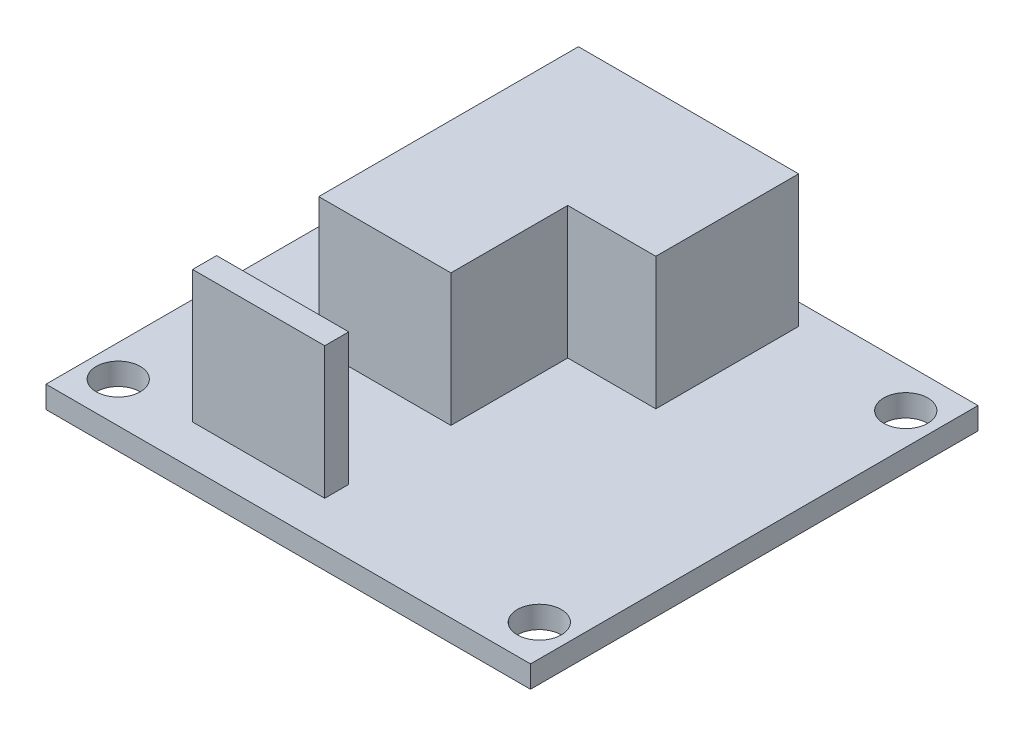
ISO-10303-21;
HEADER;
FILE_DESCRIPTION(('STEP AP214'),'2;1');
FILE_NAME('part.step','',(''),(''),'','','');
FILE_SCHEMA(('AUTOMOTIVE_DESIGN { 1 0 10303 214 1 1 1 1 }'));
ENDSEC;
DATA;
#1=APPLICATION_CONTEXT('core data for automotive mechanical design processes');
#2=APPLICATION_PROTOCOL_DEFINITION('international standard','automotive_design',2000,#1);
#3=PRODUCT_CONTEXT('',#1,'mechanical');
#4=PRODUCT('Part','Part','',(#3));
#5=PRODUCT_RELATED_PRODUCT_CATEGORY('part','',(#4));
#6=PRODUCT_DEFINITION_FORMATION('','',#4);
#7=PRODUCT_DEFINITION_CONTEXT('part definition',#1,'design');
#8=PRODUCT_DEFINITION('design','',#6,#7);
#9=PRODUCT_DEFINITION_SHAPE('','',#8);
#10=(LENGTH_UNIT() NAMED_UNIT(*) SI_UNIT(.MILLI.,.METRE.));
#11=(NAMED_UNIT(*) PLANE_ANGLE_UNIT() SI_UNIT($,.RADIAN.));
#12=(NAMED_UNIT(*) SI_UNIT($,.STERADIAN.) SOLID_ANGLE_UNIT());
#13=UNCERTAINTY_MEASURE_WITH_UNIT(LENGTH_MEASURE(1.E-05),#10,'distance_accuracy_value','');
#14=(GEOMETRIC_REPRESENTATION_CONTEXT(3) GLOBAL_UNCERTAINTY_ASSIGNED_CONTEXT((#13)) GLOBAL_UNIT_ASSIGNED_CONTEXT((#10,
#11,#12)) REPRESENTATION_CONTEXT('',''));
#15=CARTESIAN_POINT('',(0.,0.,0.));
#16=DIRECTION('',(0.,0.,1.));
#17=DIRECTION('',(1.,0.,0.));
#18=AXIS2_PLACEMENT_3D('',#15,#16,#17);
#19=CARTESIAN_POINT('',(0.,11.1125,11.4774357296748));
#20=DIRECTION('',(0.,0.,-1.));
#21=DIRECTION('',(-1.,0.,0.));
#22=AXIS2_PLACEMENT_3D('',#19,#20,#21);
#23=PLANE('',#22);
#24=DIRECTION('',(1.,0.,0.));
#25=VECTOR('',#24,1.);
#26=CARTESIAN_POINT('',(0.,1.5875,11.4774357296748));
#27=LINE('',#26,#25);
#28=CARTESIAN_POINT('',(-9.81675758309226,1.5875,11.4774357296748));
#29=VERTEX_POINT('',#28);
#30=CARTESIAN_POINT('',(-0.291757583092262,1.5875,11.4774357296748));
#31=VERTEX_POINT('',#30);
#32=EDGE_CURVE('E117',#29,#31,#27,.T.);
#33=ORIENTED_EDGE('',*,*,#32,.F.);
#34=DIRECTION('',(0.,-1.,0.));
#35=VECTOR('',#34,1.);
#36=CARTESIAN_POINT('',(-9.81675758309226,11.1125,11.4774357296748));
#37=LINE('',#36,#35);
#38=CARTESIAN_POINT('',(-9.81675758309226,11.1125,11.4774357296748));
#39=VERTEX_POINT('',#38);
#40=EDGE_CURVE('E12',#39,#29,#37,.T.);
#41=ORIENTED_EDGE('',*,*,#40,.F.);
#42=DIRECTION('',(1.,0.,0.));
#43=VECTOR('',#42,1.);
#44=CARTESIAN_POINT('',(0.,11.1125,11.4774357296748));
#45=LINE('',#44,#43);
#46=CARTESIAN_POINT('',(-0.291757583092262,11.1125,11.4774357296748));
#47=VERTEX_POINT('',#46);
#48=EDGE_CURVE('E109',#39,#47,#45,.T.);
#49=ORIENTED_EDGE('',*,*,#48,.T.);
#50=DIRECTION('',(0.,-1.,0.));
#51=VECTOR('',#50,1.);
#52=CARTESIAN_POINT('',(-0.291757583092262,11.1125,11.4774357296748));
#53=LINE('',#52,#51);
#54=EDGE_CURVE('E70',#47,#31,#53,.T.);
#55=ORIENTED_EDGE('',*,*,#54,.T.);
#56=EDGE_LOOP('',(#33,#41,#49,#55));
#57=FACE_BOUND('',#56,.T.);
#58=ADVANCED_FACE('F54',(#57),#23,.T.);
#59=CARTESIAN_POINT('',(-9.81675758309226,11.1125,0.));
#60=DIRECTION('',(-1.,0.,0.));
#61=DIRECTION('',(0.,0.,1.));
#62=AXIS2_PLACEMENT_3D('',#59,#60,#61);
#63=PLANE('',#62);
#64=DIRECTION('',(0.,0.,-1.));
#65=VECTOR('',#64,1.);
#66=CARTESIAN_POINT('',(-9.81675758309226,1.5875,0.));
#67=LINE('',#66,#65);
#68=CARTESIAN_POINT('',(-9.81675758309226,1.5875,13.208));
#69=VERTEX_POINT('',#68);
#70=EDGE_CURVE('E100',#69,#29,#67,.T.);
#71=ORIENTED_EDGE('',*,*,#70,.F.);
#72=DIRECTION('',(0.,-1.,0.));
#73=VECTOR('',#72,1.);
#74=CARTESIAN_POINT('',(-9.81675758309226,11.1125,13.208));
#75=LINE('',#74,#73);
#76=CARTESIAN_POINT('',(-9.81675758309226,11.1125,13.208));
#77=VERTEX_POINT('',#76);
#78=EDGE_CURVE('E62',#77,#69,#75,.T.);
#79=ORIENTED_EDGE('',*,*,#78,.F.);
#80=DIRECTION('',(0.,0.,-1.));
#81=VECTOR('',#80,1.);
#82=CARTESIAN_POINT('',(-9.81675758309226,11.1125,0.));
#83=LINE('',#82,#81);
#84=EDGE_CURVE('E98',#77,#39,#83,.T.);
#85=ORIENTED_EDGE('',*,*,#84,.T.);
#86=ORIENTED_EDGE('',*,*,#40,.T.);
#87=EDGE_LOOP('',(#71,#79,#85,#86));
#88=FACE_BOUND('',#87,.T.);
#89=ADVANCED_FACE('F97',(#88),#63,.T.);
#90=CARTESIAN_POINT('',(0.,11.1125,13.208));
#91=DIRECTION('',(0.,0.,1.));
#92=DIRECTION('',(1.,0.,0.));
#93=AXIS2_PLACEMENT_3D('',#90,#91,#92);
#94=PLANE('',#93);
#95=DIRECTION('',(-1.,0.,0.));
#96=VECTOR('',#95,1.);
#97=CARTESIAN_POINT('',(0.,1.5875,13.208));
#98=LINE('',#97,#96);
#99=CARTESIAN_POINT('',(-0.291757583092262,1.5875,13.208));
#100=VERTEX_POINT('',#99);
#101=EDGE_CURVE('E120',#100,#69,#98,.T.);
#102=ORIENTED_EDGE('',*,*,#101,.F.);
#103=DIRECTION('',(0.,-1.,0.));
#104=VECTOR('',#103,1.);
#105=CARTESIAN_POINT('',(-0.291757583092262,11.1125,13.208));
#106=LINE('',#105,#104);
#107=CARTESIAN_POINT('',(-0.291757583092262,11.1125,13.208));
#108=VERTEX_POINT('',#107);
#109=EDGE_CURVE('E83',#108,#100,#106,.T.);
#110=ORIENTED_EDGE('',*,*,#109,.F.);
#111=DIRECTION('',(-1.,0.,0.));
#112=VECTOR('',#111,1.);
#113=CARTESIAN_POINT('',(0.,11.1125,13.208));
#114=LINE('',#113,#112);
#115=EDGE_CURVE('E108',#108,#77,#114,.T.);
#116=ORIENTED_EDGE('',*,*,#115,.T.);
#117=ORIENTED_EDGE('',*,*,#78,.T.);
#118=EDGE_LOOP('',(#102,#110,#116,#117));
#119=FACE_BOUND('',#118,.T.);
#120=ADVANCED_FACE('F111',(#119),#94,.T.);
#121=CARTESIAN_POINT('',(-0.291757583092262,11.1125,0.));
#122=DIRECTION('',(1.,0.,0.));
#123=DIRECTION('',(0.,0.,-1.));
#124=AXIS2_PLACEMENT_3D('',#121,#122,#123);
#125=PLANE('',#124);
#126=DIRECTION('',(0.,0.,1.));
#127=VECTOR('',#126,1.);
#128=CARTESIAN_POINT('',(-0.291757583092262,1.5875,0.));
#129=LINE('',#128,#127);
#130=EDGE_CURVE('E122',#31,#100,#129,.T.);
#131=ORIENTED_EDGE('',*,*,#130,.F.);
#132=ORIENTED_EDGE('',*,*,#54,.F.);
#133=DIRECTION('',(0.,0.,1.));
#134=VECTOR('',#133,1.);
#135=CARTESIAN_POINT('',(-0.291757583092262,11.1125,0.));
#136=LINE('',#135,#134);
#137=EDGE_CURVE('E112',#47,#108,#136,.T.);
#138=ORIENTED_EDGE('',*,*,#137,.T.);
#139=ORIENTED_EDGE('',*,*,#109,.T.);
#140=EDGE_LOOP('',(#131,#132,#138,#139));
#141=FACE_BOUND('',#140,.T.);
#142=ADVANCED_FACE('F127',(#141),#125,.T.);
#143=CARTESIAN_POINT('',(0.,11.1125,0.));
#144=DIRECTION('',(0.,1.,0.));
#145=DIRECTION('',(0.,0.,1.));
#146=AXIS2_PLACEMENT_3D('',#143,#144,#145);
#147=PLANE('',#146);
#148=ORIENTED_EDGE('',*,*,#48,.F.);
#149=ORIENTED_EDGE('',*,*,#84,.F.);
#150=ORIENTED_EDGE('',*,*,#115,.F.);
#151=ORIENTED_EDGE('',*,*,#137,.F.);
#152=EDGE_LOOP('',(#148,#149,#150,#151));
#153=FACE_BOUND('',#152,.T.);
#154=ADVANCED_FACE('F106',(#153),#147,.T.);
#155=CARTESIAN_POINT('',(0.,1.5875,0.));
#156=DIRECTION('',(0.,1.,0.));
#157=DIRECTION('',(0.,0.,1.));
#158=AXIS2_PLACEMENT_3D('',#155,#156,#157);
#159=PLANE('',#158);
#160=ORIENTED_EDGE('',*,*,#32,.T.);
#161=ORIENTED_EDGE('',*,*,#130,.T.);
#162=ORIENTED_EDGE('',*,*,#101,.T.);
#163=ORIENTED_EDGE('',*,*,#70,.T.);
#164=EDGE_LOOP('',(#160,#161,#162,#163));
#165=FACE_BOUND('',#164,.T.);
#166=ADVANCED_FACE('F134',(#165),#159,.F.);
#167=CLOSED_SHELL('',(#58,#89,#120,#142,#154,#166));
#168=MANIFOLD_SOLID_BREP('B2',#167);
#169=CARTESIAN_POINT('',(0.,11.1125,-14.6038120049849));
#170=DIRECTION('',(0.,0.,-1.));
#171=DIRECTION('',(-1.,0.,0.));
#172=AXIS2_PLACEMENT_3D('',#169,#170,#171);
#173=PLANE('',#172);
#174=DIRECTION('',(1.,0.,0.));
#175=VECTOR('',#174,1.);
#176=CARTESIAN_POINT('',(0.,1.5875,-14.6038120049849));
#177=LINE('',#176,#175);
#178=CARTESIAN_POINT('',(-9.81675758309227,1.5875,-14.6038120049849));
#179=VERTEX_POINT('',#178);
#180=CARTESIAN_POINT('',(6.05824241690774,1.5875,-14.6038120049849));
#181=VERTEX_POINT('',#180);
#182=EDGE_CURVE('E280',#179,#181,#177,.T.);
#183=ORIENTED_EDGE('',*,*,#182,.F.);
#184=DIRECTION('',(0.,-1.,0.));
#185=VECTOR('',#184,1.);
#186=CARTESIAN_POINT('',(-9.81675758309227,11.1125,-14.6038120049849));
#187=LINE('',#186,#185);
#188=CARTESIAN_POINT('',(-9.81675758309227,11.1125,-14.6038120049849));
#189=VERTEX_POINT('',#188);
#190=EDGE_CURVE('E52',#189,#179,#187,.T.);
#191=ORIENTED_EDGE('',*,*,#190,.F.);
#192=DIRECTION('',(1.,0.,0.));
#193=VECTOR('',#192,1.);
#194=CARTESIAN_POINT('',(0.,11.1125,-14.6038120049849));
#195=LINE('',#194,#193);
#196=CARTESIAN_POINT('',(6.05824241690774,11.1125,-14.6038120049849));
#197=VERTEX_POINT('',#196);
#198=EDGE_CURVE('E294',#189,#197,#195,.T.);
#199=ORIENTED_EDGE('',*,*,#198,.T.);
#200=DIRECTION('',(0.,-1.,0.));
#201=VECTOR('',#200,1.);
#202=CARTESIAN_POINT('',(6.05824241690774,11.1125,-14.6038120049849));
#203=LINE('',#202,#201);
#204=EDGE_CURVE('E215',#197,#181,#203,.T.);
#205=ORIENTED_EDGE('',*,*,#204,.T.);
#206=EDGE_LOOP('',(#183,#191,#199,#205));
#207=FACE_BOUND('',#206,.T.);
#208=ADVANCED_FACE('F199',(#207),#173,.T.);
#209=CARTESIAN_POINT('',(-9.81675758309226,11.1125,0.));
#210=DIRECTION('',(-1.,0.,0.));
#211=DIRECTION('',(0.,0.,1.));
#212=AXIS2_PLACEMENT_3D('',#209,#210,#211);
#213=PLANE('',#212);
#214=DIRECTION('',(0.,0.,-1.));
#215=VECTOR('',#214,1.);
#216=CARTESIAN_POINT('',(-9.81675758309226,1.5875,0.));
#217=LINE('',#216,#215);
#218=CARTESIAN_POINT('',(-9.81675758309226,1.5875,4.11270928302274));
#219=VERTEX_POINT('',#218);
#220=EDGE_CURVE('E282',#219,#179,#217,.T.);
#221=ORIENTED_EDGE('',*,*,#220,.F.);
#222=DIRECTION('',(0.,-1.,0.));
#223=VECTOR('',#222,1.);
#224=CARTESIAN_POINT('',(-9.81675758309226,11.1125,4.11270928302274));
#225=LINE('',#224,#223);
#226=CARTESIAN_POINT('',(-9.81675758309226,11.1125,4.11270928302274));
#227=VERTEX_POINT('',#226);
#228=EDGE_CURVE('E207',#227,#219,#225,.T.);
#229=ORIENTED_EDGE('',*,*,#228,.F.);
#230=DIRECTION('',(0.,0.,-1.));
#231=VECTOR('',#230,1.);
#232=CARTESIAN_POINT('',(-9.81675758309226,11.1125,0.));
#233=LINE('',#232,#231);
#234=EDGE_CURVE('E387',#227,#189,#233,.T.);
#235=ORIENTED_EDGE('',*,*,#234,.T.);
#236=ORIENTED_EDGE('',*,*,#190,.T.);
#237=EDGE_LOOP('',(#221,#229,#235,#236));
#238=FACE_BOUND('',#237,.T.);
#239=ADVANCED_FACE('F303',(#238),#213,.T.);
#240=CARTESIAN_POINT('',(0.,11.1125,4.11270928302274));
#241=DIRECTION('',(0.,0.,1.));
#242=DIRECTION('',(1.,0.,0.));
#243=AXIS2_PLACEMENT_3D('',#240,#241,#242);
#244=PLANE('',#243);
#245=DIRECTION('',(-1.,0.,0.));
#246=VECTOR('',#245,1.);
#247=CARTESIAN_POINT('',(0.,1.5875,4.11270928302274));
#248=LINE('',#247,#246);
#249=CARTESIAN_POINT('',(-0.291757583092262,1.5875,4.11270928302274));
#250=VERTEX_POINT('',#249);
#251=EDGE_CURVE('E285',#250,#219,#248,.T.);
#252=ORIENTED_EDGE('',*,*,#251,.F.);
#253=DIRECTION('',(0.,-1.,0.));
#254=VECTOR('',#253,1.);
#255=CARTESIAN_POINT('',(-0.291757583092262,11.1125,4.11270928302274));
#256=LINE('',#255,#254);
#257=CARTESIAN_POINT('',(-0.291757583092262,11.1125,4.11270928302274));
#258=VERTEX_POINT('',#257);
#259=EDGE_CURVE('E262',#258,#250,#256,.T.);
#260=ORIENTED_EDGE('',*,*,#259,.F.);
#261=DIRECTION('',(-1.,0.,0.));
#262=VECTOR('',#261,1.);
#263=CARTESIAN_POINT('',(0.,11.1125,4.11270928302274));
#264=LINE('',#263,#262);
#265=EDGE_CURVE('E272',#258,#227,#264,.T.);
#266=ORIENTED_EDGE('',*,*,#265,.T.);
#267=ORIENTED_EDGE('',*,*,#228,.T.);
#268=EDGE_LOOP('',(#252,#260,#266,#267));
#269=FACE_BOUND('',#268,.T.);
#270=ADVANCED_FACE('F300',(#269),#244,.T.);
#271=CARTESIAN_POINT('',(-0.291757583092262,11.1125,0.));
#272=DIRECTION('',(1.,0.,0.));
#273=DIRECTION('',(0.,0.,-1.));
#274=AXIS2_PLACEMENT_3D('',#271,#272,#273);
#275=PLANE('',#274);
#276=DIRECTION('',(0.,0.,1.));
#277=VECTOR('',#276,1.);
#278=CARTESIAN_POINT('',(-0.291757583092262,1.5875,0.));
#279=LINE('',#278,#277);
#280=CARTESIAN_POINT('',(-0.291757583092263,1.5875,-4.3097252965807));
#281=VERTEX_POINT('',#280);
#282=EDGE_CURVE('E258',#281,#250,#279,.T.);
#283=ORIENTED_EDGE('',*,*,#282,.F.);
#284=DIRECTION('',(0.,-1.,0.));
#285=VECTOR('',#284,1.);
#286=CARTESIAN_POINT('',(-0.291757583092263,11.1125,-4.3097252965807));
#287=LINE('',#286,#285);
#288=CARTESIAN_POINT('',(-0.291757583092263,11.1125,-4.3097252965807));
#289=VERTEX_POINT('',#288);
#290=EDGE_CURVE('E253',#289,#281,#287,.T.);
#291=ORIENTED_EDGE('',*,*,#290,.F.);
#292=DIRECTION('',(0.,0.,1.));
#293=VECTOR('',#292,1.);
#294=CARTESIAN_POINT('',(-0.291757583092262,11.1125,0.));
#295=LINE('',#294,#293);
#296=EDGE_CURVE('E256',#289,#258,#295,.T.);
#297=ORIENTED_EDGE('',*,*,#296,.T.);
#298=ORIENTED_EDGE('',*,*,#259,.T.);
#299=EDGE_LOOP('',(#283,#291,#297,#298));
#300=FACE_BOUND('',#299,.T.);
#301=ADVANCED_FACE('F255',(#300),#275,.T.);
#302=CARTESIAN_POINT('',(0.,11.1125,-4.3097252965807));
#303=DIRECTION('',(0.,0.,1.));
#304=DIRECTION('',(1.,0.,0.));
#305=AXIS2_PLACEMENT_3D('',#302,#303,#304);
#306=PLANE('',#305);
#307=DIRECTION('',(-1.,0.,0.));
#308=VECTOR('',#307,1.);
#309=CARTESIAN_POINT('',(0.,1.5875,-4.3097252965807));
#310=LINE('',#309,#308);
#311=CARTESIAN_POINT('',(6.05824241690774,1.5875,-4.3097252965807));
#312=VERTEX_POINT('',#311);
#313=EDGE_CURVE('E289',#312,#281,#310,.T.);
#314=ORIENTED_EDGE('',*,*,#313,.F.);
#315=DIRECTION('',(0.,-1.,0.));
#316=VECTOR('',#315,1.);
#317=CARTESIAN_POINT('',(6.05824241690774,11.1125,-4.3097252965807));
#318=LINE('',#317,#316);
#319=CARTESIAN_POINT('',(6.05824241690774,11.1125,-4.3097252965807));
#320=VERTEX_POINT('',#319);
#321=EDGE_CURVE('E234',#320,#312,#318,.T.);
#322=ORIENTED_EDGE('',*,*,#321,.F.);
#323=DIRECTION('',(-1.,0.,0.));
#324=VECTOR('',#323,1.);
#325=CARTESIAN_POINT('',(0.,11.1125,-4.3097252965807));
#326=LINE('',#325,#324);
#327=EDGE_CURVE('E269',#320,#289,#326,.T.);
#328=ORIENTED_EDGE('',*,*,#327,.T.);
#329=ORIENTED_EDGE('',*,*,#290,.T.);
#330=EDGE_LOOP('',(#314,#322,#328,#329));
#331=FACE_BOUND('',#330,.T.);
#332=ADVANCED_FACE('F274',(#331),#306,.T.);
#333=CARTESIAN_POINT('',(6.05824241690774,11.1125,0.));
#334=DIRECTION('',(1.,0.,0.));
#335=DIRECTION('',(0.,0.,-1.));
#336=AXIS2_PLACEMENT_3D('',#333,#334,#335);
#337=PLANE('',#336);
#338=DIRECTION('',(0.,0.,1.));
#339=VECTOR('',#338,1.);
#340=CARTESIAN_POINT('',(6.05824241690774,1.5875,0.));
#341=LINE('',#340,#339);
#342=EDGE_CURVE('E291',#181,#312,#341,.T.);
#343=ORIENTED_EDGE('',*,*,#342,.F.);
#344=ORIENTED_EDGE('',*,*,#204,.F.);
#345=DIRECTION('',(0.,0.,1.));
#346=VECTOR('',#345,1.);
#347=CARTESIAN_POINT('',(6.05824241690774,11.1125,0.));
#348=LINE('',#347,#346);
#349=EDGE_CURVE('E275',#197,#320,#348,.T.);
#350=ORIENTED_EDGE('',*,*,#349,.T.);
#351=ORIENTED_EDGE('',*,*,#321,.T.);
#352=EDGE_LOOP('',(#343,#344,#350,#351));
#353=FACE_BOUND('',#352,.T.);
#354=ADVANCED_FACE('F306',(#353),#337,.T.);
#355=CARTESIAN_POINT('',(0.,11.1125,0.));
#356=DIRECTION('',(0.,1.,0.));
#357=DIRECTION('',(0.,0.,1.));
#358=AXIS2_PLACEMENT_3D('',#355,#356,#357);
#359=PLANE('',#358);
#360=ORIENTED_EDGE('',*,*,#198,.F.);
#361=ORIENTED_EDGE('',*,*,#234,.F.);
#362=ORIENTED_EDGE('',*,*,#265,.F.);
#363=ORIENTED_EDGE('',*,*,#296,.F.);
#364=ORIENTED_EDGE('',*,*,#327,.F.);
#365=ORIENTED_EDGE('',*,*,#349,.F.);
#366=EDGE_LOOP('',(#360,#361,#362,#363,#364,#365));
#367=FACE_BOUND('',#366,.T.);
#368=ADVANCED_FACE('F267',(#367),#359,.T.);
#369=CARTESIAN_POINT('',(0.,1.5875,0.));
#370=DIRECTION('',(0.,1.,0.));
#371=DIRECTION('',(0.,0.,1.));
#372=AXIS2_PLACEMENT_3D('',#369,#370,#371);
#373=PLANE('',#372);
#374=ORIENTED_EDGE('',*,*,#182,.T.);
#375=ORIENTED_EDGE('',*,*,#342,.T.);
#376=ORIENTED_EDGE('',*,*,#313,.T.);
#377=ORIENTED_EDGE('',*,*,#282,.T.);
#378=ORIENTED_EDGE('',*,*,#251,.T.);
#379=ORIENTED_EDGE('',*,*,#220,.T.);
#380=EDGE_LOOP('',(#374,#375,#376,#377,#378,#379));
#381=FACE_BOUND('',#380,.T.);
#382=ADVANCED_FACE('F305',(#381),#373,.F.);
#383=CLOSED_SHELL('',(#208,#239,#270,#301,#332,#354,#368,#382));
#384=MANIFOLD_SOLID_BREP('B6',#383);
#385=CARTESIAN_POINT('',(0.,1.5875,11.4774357296748));
#386=DIRECTION('',(0.,0.,-1.));
#387=DIRECTION('',(-1.,0.,0.));
#388=AXIS2_PLACEMENT_3D('',#385,#386,#387);
#389=PLANE('',#388);
#390=DIRECTION('',(1.,0.,0.));
#391=VECTOR('',#390,1.);
#392=CARTESIAN_POINT('',(0.,0.,11.4774357296748));
#393=LINE('',#392,#391);
#394=CARTESIAN_POINT('',(-9.81675758309226,0.,11.4774357296748));
#395=VERTEX_POINT('',#394);
#396=CARTESIAN_POINT('',(-0.291757583092262,0.,11.4774357296748));
#397=VERTEX_POINT('',#396);
#398=EDGE_CURVE('E568',#395,#397,#393,.T.);
#399=ORIENTED_EDGE('',*,*,#398,.T.);
#400=DIRECTION('',(0.,-1.,0.));
#401=VECTOR('',#400,1.);
#402=CARTESIAN_POINT('',(-0.291757583092262,1.5875,11.4774357296748));
#403=LINE('',#402,#401);
#404=CARTESIAN_POINT('',(-0.291757583092262,1.5875,11.4774357296748));
#405=VERTEX_POINT('',#404);
#406=EDGE_CURVE('E197',#405,#397,#403,.T.);
#407=ORIENTED_EDGE('',*,*,#406,.F.);
#408=DIRECTION('',(1.,0.,0.));
#409=VECTOR('',#408,1.);
#410=CARTESIAN_POINT('',(0.,1.5875,11.4774357296748));
#411=LINE('',#410,#409);
#412=CARTESIAN_POINT('',(-9.81675758309226,1.5875,11.4774357296748));
#413=VERTEX_POINT('',#412);
#414=EDGE_CURVE('E509',#413,#405,#411,.T.);
#415=ORIENTED_EDGE('',*,*,#414,.F.);
#416=DIRECTION('',(0.,-1.,0.));
#417=VECTOR('',#416,1.);
#418=CARTESIAN_POINT('',(-9.81675758309226,1.5875,11.4774357296748));
#419=LINE('',#418,#417);
#420=EDGE_CURVE('E412',#413,#395,#419,.T.);
#421=ORIENTED_EDGE('',*,*,#420,.T.);
#422=EDGE_LOOP('',(#399,#407,#415,#421));
#423=FACE_BOUND('',#422,.T.);
#424=ADVANCED_FACE('F393',(#423),#389,.F.);
#425=CARTESIAN_POINT('',(-0.291757583092262,1.5875,0.));
#426=DIRECTION('',(1.,0.,0.));
#427=DIRECTION('',(0.,0.,-1.));
#428=AXIS2_PLACEMENT_3D('',#425,#426,#427);
#429=PLANE('',#428);
#430=DIRECTION('',(0.,0.,1.));
#431=VECTOR('',#430,1.);
#432=CARTESIAN_POINT('',(-0.291757583092262,0.,0.));
#433=LINE('',#432,#431);
#434=CARTESIAN_POINT('',(-0.291757583092262,0.,13.208));
#435=VERTEX_POINT('',#434);
#436=EDGE_CURVE('E515',#397,#435,#433,.T.);
#437=ORIENTED_EDGE('',*,*,#436,.T.);
#438=DIRECTION('',(0.,-1.,0.));
#439=VECTOR('',#438,1.);
#440=CARTESIAN_POINT('',(-0.291757583092262,1.5875,13.208));
#441=LINE('',#440,#439);
#442=CARTESIAN_POINT('',(-0.291757583092262,1.5875,13.208));
#443=VERTEX_POINT('',#442);
#444=EDGE_CURVE('E403',#443,#435,#441,.T.);
#445=ORIENTED_EDGE('',*,*,#444,.F.);
#446=DIRECTION('',(0.,0.,1.));
#447=VECTOR('',#446,1.);
#448=CARTESIAN_POINT('',(-0.291757583092262,1.5875,0.));
#449=LINE('',#448,#447);
#450=EDGE_CURVE('E502',#405,#443,#449,.T.);
#451=ORIENTED_EDGE('',*,*,#450,.F.);
#452=ORIENTED_EDGE('',*,*,#406,.T.);
#453=EDGE_LOOP('',(#437,#445,#451,#452));
#454=FACE_BOUND('',#453,.T.);
#455=ADVANCED_FACE('F514',(#454),#429,.F.);
#456=CARTESIAN_POINT('',(0.,1.5875,13.208));
#457=DIRECTION('',(0.,0.,-1.));
#458=DIRECTION('',(-1.,0.,0.));
#459=AXIS2_PLACEMENT_3D('',#456,#457,#458);
#460=PLANE('',#459);
#461=DIRECTION('',(1.,0.,0.));
#462=VECTOR('',#461,1.);
#463=CARTESIAN_POINT('',(0.,0.,13.208));
#464=LINE('',#463,#462);
#465=CARTESIAN_POINT('',(-9.81675758309226,0.,13.208));
#466=VERTEX_POINT('',#465);
#467=EDGE_CURVE('E571',#466,#435,#464,.T.);
#468=ORIENTED_EDGE('',*,*,#467,.F.);
#469=DIRECTION('',(0.,-1.,0.));
#470=VECTOR('',#469,1.);
#471=CARTESIAN_POINT('',(-9.81675758309226,1.5875,13.208));
#472=LINE('',#471,#470);
#473=CARTESIAN_POINT('',(-9.81675758309226,1.5875,13.208));
#474=VERTEX_POINT('',#473);
#475=EDGE_CURVE('E456',#474,#466,#472,.T.);
#476=ORIENTED_EDGE('',*,*,#475,.F.);
#477=DIRECTION('',(1.,0.,0.));
#478=VECTOR('',#477,1.);
#479=CARTESIAN_POINT('',(0.,1.5875,13.208));
#480=LINE('',#479,#478);
#481=EDGE_CURVE('E508',#474,#443,#480,.T.);
#482=ORIENTED_EDGE('',*,*,#481,.T.);
#483=ORIENTED_EDGE('',*,*,#444,.T.);
#484=EDGE_LOOP('',(#468,#476,#482,#483));
#485=FACE_BOUND('',#484,.T.);
#486=ADVANCED_FACE('F519',(#485),#460,.T.);
#487=CARTESIAN_POINT('',(0.,1.5875,-14.6038120049849));
#488=DIRECTION('',(0.,0.,-1.));
#489=DIRECTION('',(-1.,0.,0.));
#490=AXIS2_PLACEMENT_3D('',#487,#488,#489);
#491=PLANE('',#490);
#492=DIRECTION('',(1.,0.,0.));
#493=VECTOR('',#492,1.);
#494=CARTESIAN_POINT('',(0.,0.,-14.6038120049849));
#495=LINE('',#494,#493);
#496=CARTESIAN_POINT('',(-9.81675758309227,0.,-14.6038120049849));
#497=VERTEX_POINT('',#496);
#498=CARTESIAN_POINT('',(6.05824241690774,0.,-14.6038120049849));
#499=VERTEX_POINT('',#498);
#500=EDGE_CURVE('E550',#497,#499,#495,.T.);
#501=ORIENTED_EDGE('',*,*,#500,.T.);
#502=DIRECTION('',(0.,-1.,0.));
#503=VECTOR('',#502,1.);
#504=CARTESIAN_POINT('',(6.05824241690774,1.5875,-14.6038120049849));
#505=LINE('',#504,#503);
#506=CARTESIAN_POINT('',(6.05824241690774,1.5875,-14.6038120049849));
#507=VERTEX_POINT('',#506);
#508=EDGE_CURVE('E584',#507,#499,#505,.T.);
#509=ORIENTED_EDGE('',*,*,#508,.F.);
#510=DIRECTION('',(1.,0.,0.));
#511=VECTOR('',#510,1.);
#512=CARTESIAN_POINT('',(0.,1.5875,-14.6038120049849));
#513=LINE('',#512,#511);
#514=CARTESIAN_POINT('',(-9.81675758309227,1.5875,-14.6038120049849));
#515=VERTEX_POINT('',#514);
#516=EDGE_CURVE('E624',#515,#507,#513,.T.);
#517=ORIENTED_EDGE('',*,*,#516,.F.);
#518=DIRECTION('',(0.,-1.,0.));
#519=VECTOR('',#518,1.);
#520=CARTESIAN_POINT('',(-9.81675758309227,1.5875,-14.6038120049849));
#521=LINE('',#520,#519);
#522=EDGE_CURVE('E586',#515,#497,#521,.T.);
#523=ORIENTED_EDGE('',*,*,#522,.T.);
#524=EDGE_LOOP('',(#501,#509,#517,#523));
#525=FACE_BOUND('',#524,.T.);
#526=ADVANCED_FACE('F663',(#525),#491,.F.);
#527=CARTESIAN_POINT('',(6.05824241690774,1.5875,0.));
#528=DIRECTION('',(1.,0.,0.));
#529=DIRECTION('',(0.,0.,-1.));
#530=AXIS2_PLACEMENT_3D('',#527,#528,#529);
#531=PLANE('',#530);
#532=DIRECTION('',(0.,0.,1.));
#533=VECTOR('',#532,1.);
#534=CARTESIAN_POINT('',(6.05824241690774,0.,0.));
#535=LINE('',#534,#533);
#536=CARTESIAN_POINT('',(6.05824241690774,0.,-4.3097252965807));
#537=VERTEX_POINT('',#536);
#538=EDGE_CURVE('E553',#499,#537,#535,.T.);
#539=ORIENTED_EDGE('',*,*,#538,.T.);
#540=DIRECTION('',(0.,-1.,0.));
#541=VECTOR('',#540,1.);
#542=CARTESIAN_POINT('',(6.05824241690774,1.5875,-4.3097252965807));
#543=LINE('',#542,#541);
#544=CARTESIAN_POINT('',(6.05824241690774,1.5875,-4.3097252965807));
#545=VERTEX_POINT('',#544);
#546=EDGE_CURVE('E594',#545,#537,#543,.T.);
#547=ORIENTED_EDGE('',*,*,#546,.F.);
#548=DIRECTION('',(0.,0.,1.));
#549=VECTOR('',#548,1.);
#550=CARTESIAN_POINT('',(6.05824241690774,1.5875,0.));
#551=LINE('',#550,#549);
#552=EDGE_CURVE('E634',#507,#545,#551,.T.);
#553=ORIENTED_EDGE('',*,*,#552,.F.);
#554=ORIENTED_EDGE('',*,*,#508,.T.);
#555=EDGE_LOOP('',(#539,#547,#553,#554));
#556=FACE_BOUND('',#555,.T.);
#557=ADVANCED_FACE('F665',(#556),#531,.F.);
#558=CARTESIAN_POINT('',(0.,1.5875,-4.3097252965807));
#559=DIRECTION('',(0.,0.,-1.));
#560=DIRECTION('',(-1.,0.,0.));
#561=AXIS2_PLACEMENT_3D('',#558,#559,#560);
#562=PLANE('',#561);
#563=DIRECTION('',(1.,0.,0.));
#564=VECTOR('',#563,1.);
#565=CARTESIAN_POINT('',(0.,0.,-4.3097252965807));
#566=LINE('',#565,#564);
#567=CARTESIAN_POINT('',(-0.291757583092263,0.,-4.3097252965807));
#568=VERTEX_POINT('',#567);
#569=EDGE_CURVE('E556',#568,#537,#566,.T.);
#570=ORIENTED_EDGE('',*,*,#569,.F.);
#571=DIRECTION('',(0.,-1.,0.));
#572=VECTOR('',#571,1.);
#573=CARTESIAN_POINT('',(-0.291757583092263,1.5875,-4.3097252965807));
#574=LINE('',#573,#572);
#575=CARTESIAN_POINT('',(-0.291757583092263,1.5875,-4.3097252965807));
#576=VERTEX_POINT('',#575);
#577=EDGE_CURVE('E592',#576,#568,#574,.T.);
#578=ORIENTED_EDGE('',*,*,#577,.F.);
#579=DIRECTION('',(1.,0.,0.));
#580=VECTOR('',#579,1.);
#581=CARTESIAN_POINT('',(0.,1.5875,-4.3097252965807));
#582=LINE('',#581,#580);
#583=EDGE_CURVE('E636',#576,#545,#582,.T.);
#584=ORIENTED_EDGE('',*,*,#583,.T.);
#585=ORIENTED_EDGE('',*,*,#546,.T.);
#586=EDGE_LOOP('',(#570,#578,#584,#585));
#587=FACE_BOUND('',#586,.T.);
#588=ADVANCED_FACE('F669',(#587),#562,.T.);
#589=CARTESIAN_POINT('',(-0.291757583092262,1.5875,0.));
#590=DIRECTION('',(1.,0.,0.));
#591=DIRECTION('',(0.,0.,-1.));
#592=AXIS2_PLACEMENT_3D('',#589,#590,#591);
#593=PLANE('',#592);
#594=DIRECTION('',(0.,0.,1.));
#595=VECTOR('',#594,1.);
#596=CARTESIAN_POINT('',(-0.291757583092262,0.,0.));
#597=LINE('',#596,#595);
#598=CARTESIAN_POINT('',(-0.291757583092262,0.,4.11270928302274));
#599=VERTEX_POINT('',#598);
#600=EDGE_CURVE('E559',#568,#599,#597,.T.);
#601=ORIENTED_EDGE('',*,*,#600,.T.);
#602=DIRECTION('',(0.,-1.,0.));
#603=VECTOR('',#602,1.);
#604=CARTESIAN_POINT('',(-0.291757583092262,1.5875,4.11270928302274));
#605=LINE('',#604,#603);
#606=CARTESIAN_POINT('',(-0.291757583092262,1.5875,4.11270928302274));
#607=VERTEX_POINT('',#606);
#608=EDGE_CURVE('E590',#607,#599,#605,.T.);
#609=ORIENTED_EDGE('',*,*,#608,.F.);
#610=DIRECTION('',(0.,0.,1.));
#611=VECTOR('',#610,1.);
#612=CARTESIAN_POINT('',(-0.291757583092262,1.5875,0.));
#613=LINE('',#612,#611);
#614=EDGE_CURVE('E639',#576,#607,#613,.T.);
#615=ORIENTED_EDGE('',*,*,#614,.F.);
#616=ORIENTED_EDGE('',*,*,#577,.T.);
#617=EDGE_LOOP('',(#601,#609,#615,#616));
#618=FACE_BOUND('',#617,.T.);
#619=ADVANCED_FACE('F671',(#618),#593,.F.);
#620=CARTESIAN_POINT('',(0.,1.5875,4.11270928302274));
#621=DIRECTION('',(0.,0.,-1.));
#622=DIRECTION('',(-1.,0.,0.));
#623=AXIS2_PLACEMENT_3D('',#620,#621,#622);
#624=PLANE('',#623);
#625=DIRECTION('',(1.,0.,0.));
#626=VECTOR('',#625,1.);
#627=CARTESIAN_POINT('',(0.,0.,4.11270928302274));
#628=LINE('',#627,#626);
#629=CARTESIAN_POINT('',(-9.81675758309226,0.,4.11270928302274));
#630=VERTEX_POINT('',#629);
#631=EDGE_CURVE('E562',#630,#599,#628,.T.);
#632=ORIENTED_EDGE('',*,*,#631,.F.);
#633=DIRECTION('',(0.,-1.,0.));
#634=VECTOR('',#633,1.);
#635=CARTESIAN_POINT('',(-9.81675758309226,1.5875,4.11270928302274));
#636=LINE('',#635,#634);
#637=CARTESIAN_POINT('',(-9.81675758309226,1.5875,4.11270928302274));
#638=VERTEX_POINT('',#637);
#639=EDGE_CURVE('E588',#638,#630,#636,.T.);
#640=ORIENTED_EDGE('',*,*,#639,.F.);
#641=DIRECTION('',(1.,0.,0.));
#642=VECTOR('',#641,1.);
#643=CARTESIAN_POINT('',(0.,1.5875,4.11270928302274));
#644=LINE('',#643,#642);
#645=EDGE_CURVE('E641',#638,#607,#644,.T.);
#646=ORIENTED_EDGE('',*,*,#645,.T.);
#647=ORIENTED_EDGE('',*,*,#608,.T.);
#648=EDGE_LOOP('',(#632,#640,#646,#647));
#649=FACE_BOUND('',#648,.T.);
#650=ADVANCED_FACE('F658',(#649),#624,.T.);
#651=CARTESIAN_POINT('',(17.4625,1.5875,0.));
#652=DIRECTION('',(1.,0.,0.));
#653=DIRECTION('',(0.,0.,-1.));
#654=AXIS2_PLACEMENT_3D('',#651,#652,#653);
#655=PLANE('',#654);
#656=DIRECTION('',(0.,0.,1.));
#657=VECTOR('',#656,1.);
#658=CARTESIAN_POINT('',(17.4625,0.,0.));
#659=LINE('',#658,#657);
#660=CARTESIAN_POINT('',(17.4625,0.,-16.129));
#661=VERTEX_POINT('',#660);
#662=CARTESIAN_POINT('',(17.4625,0.,16.129));
#663=VERTEX_POINT('',#662);
#664=EDGE_CURVE('E538',#661,#663,#659,.T.);
#665=ORIENTED_EDGE('',*,*,#664,.F.);
#666=DIRECTION('',(0.,-1.,0.));
#667=VECTOR('',#666,1.);
#668=CARTESIAN_POINT('',(17.4625,1.5875,-16.129));
#669=LINE('',#668,#667);
#670=CARTESIAN_POINT('',(17.4625,1.5875,-16.129));
#671=VERTEX_POINT('',#670);
#672=EDGE_CURVE('E397',#671,#661,#669,.T.);
#673=ORIENTED_EDGE('',*,*,#672,.F.);
#674=DIRECTION('',(0.,0.,1.));
#675=VECTOR('',#674,1.);
#676=CARTESIAN_POINT('',(17.4625,1.5875,0.));
#677=LINE('',#676,#675);
#678=CARTESIAN_POINT('',(17.4625,1.5875,16.129));
#679=VERTEX_POINT('',#678);
#680=EDGE_CURVE('E628',#671,#679,#677,.T.);
#681=ORIENTED_EDGE('',*,*,#680,.T.);
#682=DIRECTION('',(0.,-1.,0.));
#683=VECTOR('',#682,1.);
#684=CARTESIAN_POINT('',(17.4625,1.5875,16.129));
#685=LINE('',#684,#683);
#686=EDGE_CURVE('E531',#679,#663,#685,.T.);
#687=ORIENTED_EDGE('',*,*,#686,.T.);
#688=EDGE_LOOP('',(#665,#673,#681,#687));
#689=FACE_BOUND('',#688,.T.);
#690=ADVANCED_FACE('F611',(#689),#655,.T.);
#691=CARTESIAN_POINT('',(0.,1.5875,-16.129));
#692=DIRECTION('',(0.,0.,-1.));
#693=DIRECTION('',(-1.,0.,0.));
#694=AXIS2_PLACEMENT_3D('',#691,#692,#693);
#695=PLANE('',#694);
#696=DIRECTION('',(1.,0.,0.));
#697=VECTOR('',#696,1.);
#698=CARTESIAN_POINT('',(0.,0.,-16.129));
#699=LINE('',#698,#697);
#700=CARTESIAN_POINT('',(-17.4625,0.,-16.129));
#701=VERTEX_POINT('',#700);
#702=EDGE_CURVE('E541',#701,#661,#699,.T.);
#703=ORIENTED_EDGE('',*,*,#702,.F.);
#704=DIRECTION('',(0.,-1.,0.));
#705=VECTOR('',#704,1.);
#706=CARTESIAN_POINT('',(-17.4625,1.5875,-16.129));
#707=LINE('',#706,#705);
#708=CARTESIAN_POINT('',(-17.4625,1.5875,-16.129));
#709=VERTEX_POINT('',#708);
#710=EDGE_CURVE('E601',#709,#701,#707,.T.);
#711=ORIENTED_EDGE('',*,*,#710,.F.);
#712=DIRECTION('',(1.,0.,0.));
#713=VECTOR('',#712,1.);
#714=CARTESIAN_POINT('',(0.,1.5875,-16.129));
#715=LINE('',#714,#713);
#716=EDGE_CURVE('E610',#709,#671,#715,.T.);
#717=ORIENTED_EDGE('',*,*,#716,.T.);
#718=ORIENTED_EDGE('',*,*,#672,.T.);
#719=EDGE_LOOP('',(#703,#711,#717,#718));
#720=FACE_BOUND('',#719,.T.);
#721=ADVANCED_FACE('F608',(#720),#695,.T.);
#722=CARTESIAN_POINT('',(-17.4625,1.5875,0.));
#723=DIRECTION('',(1.,0.,0.));
#724=DIRECTION('',(0.,0.,-1.));
#725=AXIS2_PLACEMENT_3D('',#722,#723,#724);
#726=PLANE('',#725);
#727=DIRECTION('',(0.,0.,1.));
#728=VECTOR('',#727,1.);
#729=CARTESIAN_POINT('',(-17.4625,0.,0.));
#730=LINE('',#729,#728);
#731=CARTESIAN_POINT('',(-17.4625,0.,16.129));
#732=VERTEX_POINT('',#731);
#733=EDGE_CURVE('E544',#701,#732,#730,.T.);
#734=ORIENTED_EDGE('',*,*,#733,.T.);
#735=DIRECTION('',(0.,-1.,0.));
#736=VECTOR('',#735,1.);
#737=CARTESIAN_POINT('',(-17.4625,1.5875,16.129));
#738=LINE('',#737,#736);
#739=CARTESIAN_POINT('',(-17.4625,1.5875,16.129));
#740=VERTEX_POINT('',#739);
#741=EDGE_CURVE('E599',#740,#732,#738,.T.);
#742=ORIENTED_EDGE('',*,*,#741,.F.);
#743=DIRECTION('',(0.,0.,1.));
#744=VECTOR('',#743,1.);
#745=CARTESIAN_POINT('',(-17.4625,1.5875,0.));
#746=LINE('',#745,#744);
#747=EDGE_CURVE('E619',#709,#740,#746,.T.);
#748=ORIENTED_EDGE('',*,*,#747,.F.);
#749=ORIENTED_EDGE('',*,*,#710,.T.);
#750=EDGE_LOOP('',(#734,#742,#748,#749));
#751=FACE_BOUND('',#750,.T.);
#752=ADVANCED_FACE('F617',(#751),#726,.F.);
#753=CARTESIAN_POINT('',(15.1765,1.5875,13.208));
#754=DIRECTION('',(0.,-1.,0.));
#755=DIRECTION('',(0.,0.,-1.));
#756=AXIS2_PLACEMENT_3D('',#753,#754,#755);
#757=CYLINDRICAL_SURFACE('',#756,1.5875);
#758=CARTESIAN_POINT('',(15.1765,1.5875,13.208));
#759=DIRECTION('',(0.,1.,0.));
#760=DIRECTION('',(0.,0.,1.));
#761=AXIS2_PLACEMENT_3D('',#758,#759,#760);
#762=CIRCLE('',#761,1.5875);
#763=CARTESIAN_POINT('',(15.1765,1.5875,14.7955));
#764=VERTEX_POINT('',#763);
#765=EDGE_CURVE('E522',#764,#764,#762,.T.);
#766=ORIENTED_EDGE('',*,*,#765,.T.);
#767=EDGE_LOOP('',(#766));
#768=FACE_BOUND('',#767,.T.);
#769=CARTESIAN_POINT('',(15.1765,0.,13.208));
#770=DIRECTION('',(0.,1.,0.));
#771=DIRECTION('',(0.,0.,1.));
#772=AXIS2_PLACEMENT_3D('',#769,#770,#771);
#773=CIRCLE('',#772,1.5875);
#774=CARTESIAN_POINT('',(15.1765,0.,14.7955));
#775=VERTEX_POINT('',#774);
#776=EDGE_CURVE('E576',#775,#775,#773,.T.);
#777=ORIENTED_EDGE('',*,*,#776,.F.);
#778=EDGE_LOOP('',(#777));
#779=FACE_BOUND('',#778,.T.);
#780=ADVANCED_FACE('F696',(#768,#779),#757,.F.);
#781=CARTESIAN_POINT('',(-9.81675758309226,1.5875,0.));
#782=DIRECTION('',(1.,0.,0.));
#783=DIRECTION('',(0.,0.,-1.));
#784=AXIS2_PLACEMENT_3D('',#781,#782,#783);
#785=PLANE('',#784);
#786=DIRECTION('',(0.,0.,1.));
#787=VECTOR('',#786,1.);
#788=CARTESIAN_POINT('',(-9.81675758309226,0.,0.));
#789=LINE('',#788,#787);
#790=EDGE_CURVE('E573',#395,#466,#789,.T.);
#791=ORIENTED_EDGE('',*,*,#790,.F.);
#792=ORIENTED_EDGE('',*,*,#420,.F.);
#793=DIRECTION('',(0.,0.,1.));
#794=VECTOR('',#793,1.);
#795=CARTESIAN_POINT('',(-9.81675758309226,1.5875,0.));
#796=LINE('',#795,#794);
#797=EDGE_CURVE('E520',#413,#474,#796,.T.);
#798=ORIENTED_EDGE('',*,*,#797,.T.);
#799=ORIENTED_EDGE('',*,*,#475,.T.);
#800=EDGE_LOOP('',(#791,#792,#798,#799));
#801=FACE_BOUND('',#800,.T.);
#802=ADVANCED_FACE('F689',(#801),#785,.T.);
#803=CARTESIAN_POINT('',(-9.81675758309226,1.5875,0.));
#804=DIRECTION('',(1.,0.,0.));
#805=DIRECTION('',(0.,0.,-1.));
#806=AXIS2_PLACEMENT_3D('',#803,#804,#805);
#807=PLANE('',#806);
#808=DIRECTION('',(0.,0.,1.));
#809=VECTOR('',#808,1.);
#810=CARTESIAN_POINT('',(-9.81675758309226,0.,0.));
#811=LINE('',#810,#809);
#812=EDGE_CURVE('E565',#497,#630,#811,.T.);
#813=ORIENTED_EDGE('',*,*,#812,.F.);
#814=ORIENTED_EDGE('',*,*,#522,.F.);
#815=DIRECTION('',(0.,0.,1.));
#816=VECTOR('',#815,1.);
#817=CARTESIAN_POINT('',(-9.81675758309226,1.5875,0.));
#818=LINE('',#817,#816);
#819=EDGE_CURVE('E644',#515,#638,#818,.T.);
#820=ORIENTED_EDGE('',*,*,#819,.T.);
#821=ORIENTED_EDGE('',*,*,#639,.T.);
#822=EDGE_LOOP('',(#813,#814,#820,#821));
#823=FACE_BOUND('',#822,.T.);
#824=ADVANCED_FACE('F649',(#823),#807,.T.);
#825=CARTESIAN_POINT('',(0.,1.5875,16.129));
#826=DIRECTION('',(0.,0.,-1.));
#827=DIRECTION('',(-1.,0.,0.));
#828=AXIS2_PLACEMENT_3D('',#825,#826,#827);
#829=PLANE('',#828);
#830=DIRECTION('',(1.,0.,0.));
#831=VECTOR('',#830,1.);
#832=CARTESIAN_POINT('',(0.,0.,16.129));
#833=LINE('',#832,#831);
#834=EDGE_CURVE('E547',#732,#663,#833,.T.);
#835=ORIENTED_EDGE('',*,*,#834,.T.);
#836=ORIENTED_EDGE('',*,*,#686,.F.);
#837=DIRECTION('',(1.,0.,0.));
#838=VECTOR('',#837,1.);
#839=CARTESIAN_POINT('',(0.,1.5875,16.129));
#840=LINE('',#839,#838);
#841=EDGE_CURVE('E622',#740,#679,#840,.T.);
#842=ORIENTED_EDGE('',*,*,#841,.F.);
#843=ORIENTED_EDGE('',*,*,#741,.T.);
#844=EDGE_LOOP('',(#835,#836,#842,#843));
#845=FACE_BOUND('',#844,.T.);
#846=ADVANCED_FACE('F621',(#845),#829,.F.);
#847=CARTESIAN_POINT('',(-15.1765,1.5875,-13.208));
#848=DIRECTION('',(0.,-1.,0.));
#849=DIRECTION('',(0.,0.,-1.));
#850=AXIS2_PLACEMENT_3D('',#847,#848,#849);
#851=CYLINDRICAL_SURFACE('',#850,1.5875);
#852=CARTESIAN_POINT('',(-15.1765,1.5875,-13.208));
#853=DIRECTION('',(0.,1.,0.));
#854=DIRECTION('',(0.,0.,1.));
#855=AXIS2_PLACEMENT_3D('',#852,#853,#854);
#856=CIRCLE('',#855,1.5875);
#857=CARTESIAN_POINT('',(-15.1765,1.5875,-11.6205));
#858=VERTEX_POINT('',#857);
#859=EDGE_CURVE('E729',#858,#858,#856,.T.);
#860=ORIENTED_EDGE('',*,*,#859,.T.);
#861=EDGE_LOOP('',(#860));
#862=FACE_BOUND('',#861,.T.);
#863=CARTESIAN_POINT('',(-15.1765,0.,-13.208));
#864=DIRECTION('',(0.,1.,0.));
#865=DIRECTION('',(0.,0.,1.));
#866=AXIS2_PLACEMENT_3D('',#863,#864,#865);
#867=CIRCLE('',#866,1.5875);
#868=CARTESIAN_POINT('',(-15.1765,0.,-11.6205));
#869=VERTEX_POINT('',#868);
#870=EDGE_CURVE('E535',#869,#869,#867,.T.);
#871=ORIENTED_EDGE('',*,*,#870,.F.);
#872=EDGE_LOOP('',(#871));
#873=FACE_BOUND('',#872,.T.);
#874=ADVANCED_FACE('F694',(#862,#873),#851,.F.);
#875=CARTESIAN_POINT('',(15.1765,1.5875,-13.208));
#876=DIRECTION('',(0.,-1.,0.));
#877=DIRECTION('',(0.,0.,-1.));
#878=AXIS2_PLACEMENT_3D('',#875,#876,#877);
#879=CYLINDRICAL_SURFACE('',#878,1.5875);
#880=CARTESIAN_POINT('',(15.1765,1.5875,-13.208));
#881=DIRECTION('',(0.,1.,0.));
#882=DIRECTION('',(0.,0.,1.));
#883=AXIS2_PLACEMENT_3D('',#880,#881,#882);
#884=CIRCLE('',#883,1.5875);
#885=CARTESIAN_POINT('',(15.1765,1.5875,-11.6205));
#886=VERTEX_POINT('',#885);
#887=EDGE_CURVE('E582',#886,#886,#884,.F.);
#888=ORIENTED_EDGE('',*,*,#887,.F.);
#889=EDGE_LOOP('',(#888));
#890=FACE_BOUND('',#889,.T.);
#891=CARTESIAN_POINT('',(15.1765,0.,-13.208));
#892=DIRECTION('',(0.,1.,0.));
#893=DIRECTION('',(0.,0.,1.));
#894=AXIS2_PLACEMENT_3D('',#891,#892,#893);
#895=CIRCLE('',#894,1.5875);
#896=CARTESIAN_POINT('',(15.1765,0.,-11.6205));
#897=VERTEX_POINT('',#896);
#898=EDGE_CURVE('E532',#897,#897,#895,.F.);
#899=ORIENTED_EDGE('',*,*,#898,.T.);
#900=EDGE_LOOP('',(#899));
#901=FACE_BOUND('',#900,.T.);
#902=ADVANCED_FACE('F395',(#890,#901),#879,.F.);
#903=CARTESIAN_POINT('',(-15.1765,1.5875,13.208));
#904=DIRECTION('',(0.,-1.,0.));
#905=DIRECTION('',(0.,0.,-1.));
#906=AXIS2_PLACEMENT_3D('',#903,#904,#905);
#907=CYLINDRICAL_SURFACE('',#906,1.5875);
#908=CARTESIAN_POINT('',(-15.1765,1.5875,13.208));
#909=DIRECTION('',(0.,1.,0.));
#910=DIRECTION('',(0.,0.,1.));
#911=AXIS2_PLACEMENT_3D('',#908,#909,#910);
#912=CIRCLE('',#911,1.5875);
#913=CARTESIAN_POINT('',(-15.1765,1.5875,14.7955));
#914=VERTEX_POINT('',#913);
#915=EDGE_CURVE('E528',#914,#914,#912,.F.);
#916=ORIENTED_EDGE('',*,*,#915,.F.);
#917=EDGE_LOOP('',(#916));
#918=FACE_BOUND('',#917,.T.);
#919=CARTESIAN_POINT('',(-15.1765,0.,13.208));
#920=DIRECTION('',(0.,1.,0.));
#921=DIRECTION('',(0.,0.,1.));
#922=AXIS2_PLACEMENT_3D('',#919,#920,#921);
#923=CIRCLE('',#922,1.5875);
#924=CARTESIAN_POINT('',(-15.1765,0.,14.7955));
#925=VERTEX_POINT('',#924);
#926=EDGE_CURVE('E579',#925,#925,#923,.F.);
#927=ORIENTED_EDGE('',*,*,#926,.T.);
#928=EDGE_LOOP('',(#927));
#929=FACE_BOUND('',#928,.T.);
#930=ADVANCED_FACE('F724',(#918,#929),#907,.F.);
#931=CARTESIAN_POINT('',(0.,1.5875,0.));
#932=DIRECTION('',(0.,1.,0.));
#933=DIRECTION('',(0.,0.,1.));
#934=AXIS2_PLACEMENT_3D('',#931,#932,#933);
#935=PLANE('',#934);
#936=ORIENTED_EDGE('',*,*,#887,.T.);
#937=EDGE_LOOP('',(#936));
#938=FACE_BOUND('',#937,.T.);
#939=ORIENTED_EDGE('',*,*,#859,.F.);
#940=EDGE_LOOP('',(#939));
#941=FACE_BOUND('',#940,.T.);
#942=ORIENTED_EDGE('',*,*,#680,.F.);
#943=ORIENTED_EDGE('',*,*,#716,.F.);
#944=ORIENTED_EDGE('',*,*,#747,.T.);
#945=ORIENTED_EDGE('',*,*,#841,.T.);
#946=EDGE_LOOP('',(#942,#943,#944,#945));
#947=FACE_BOUND('',#946,.T.);
#948=ORIENTED_EDGE('',*,*,#516,.T.);
#949=ORIENTED_EDGE('',*,*,#552,.T.);
#950=ORIENTED_EDGE('',*,*,#583,.F.);
#951=ORIENTED_EDGE('',*,*,#614,.T.);
#952=ORIENTED_EDGE('',*,*,#645,.F.);
#953=ORIENTED_EDGE('',*,*,#819,.F.);
#954=EDGE_LOOP('',(#948,#949,#950,#951,#952,#953));
#955=FACE_BOUND('',#954,.T.);
#956=ORIENTED_EDGE('',*,*,#414,.T.);
#957=ORIENTED_EDGE('',*,*,#450,.T.);
#958=ORIENTED_EDGE('',*,*,#481,.F.);
#959=ORIENTED_EDGE('',*,*,#797,.F.);
#960=EDGE_LOOP('',(#956,#957,#958,#959));
#961=FACE_BOUND('',#960,.T.);
#962=ORIENTED_EDGE('',*,*,#765,.F.);
#963=EDGE_LOOP('',(#962));
#964=FACE_BOUND('',#963,.T.);
#965=ORIENTED_EDGE('',*,*,#915,.T.);
#966=EDGE_LOOP('',(#965));
#967=FACE_BOUND('',#966,.T.);
#968=ADVANCED_FACE('F504',(#938,#941,#947,#955,#961,#964,#967),#935,.T.);
#969=CARTESIAN_POINT('',(0.,0.,0.));
#970=DIRECTION('',(0.,1.,0.));
#971=DIRECTION('',(0.,0.,1.));
#972=AXIS2_PLACEMENT_3D('',#969,#970,#971);
#973=PLANE('',#972);
#974=ORIENTED_EDGE('',*,*,#898,.F.);
#975=EDGE_LOOP('',(#974));
#976=FACE_BOUND('',#975,.T.);
#977=ORIENTED_EDGE('',*,*,#870,.T.);
#978=EDGE_LOOP('',(#977));
#979=FACE_BOUND('',#978,.T.);
#980=ORIENTED_EDGE('',*,*,#664,.T.);
#981=ORIENTED_EDGE('',*,*,#834,.F.);
#982=ORIENTED_EDGE('',*,*,#733,.F.);
#983=ORIENTED_EDGE('',*,*,#702,.T.);
#984=EDGE_LOOP('',(#980,#981,#982,#983));
#985=FACE_BOUND('',#984,.T.);
#986=ORIENTED_EDGE('',*,*,#500,.F.);
#987=ORIENTED_EDGE('',*,*,#812,.T.);
#988=ORIENTED_EDGE('',*,*,#631,.T.);
#989=ORIENTED_EDGE('',*,*,#600,.F.);
#990=ORIENTED_EDGE('',*,*,#569,.T.);
#991=ORIENTED_EDGE('',*,*,#538,.F.);
#992=EDGE_LOOP('',(#986,#987,#988,#989,#990,#991));
#993=FACE_BOUND('',#992,.T.);
#994=ORIENTED_EDGE('',*,*,#398,.F.);
#995=ORIENTED_EDGE('',*,*,#790,.T.);
#996=ORIENTED_EDGE('',*,*,#467,.T.);
#997=ORIENTED_EDGE('',*,*,#436,.F.);
#998=EDGE_LOOP('',(#994,#995,#996,#997));
#999=FACE_BOUND('',#998,.T.);
#1000=ORIENTED_EDGE('',*,*,#776,.T.);
#1001=EDGE_LOOP('',(#1000));
#1002=FACE_BOUND('',#1001,.T.);
#1003=ORIENTED_EDGE('',*,*,#926,.F.);
#1004=EDGE_LOOP('',(#1003));
#1005=FACE_BOUND('',#1004,.T.);
#1006=ADVANCED_FACE('F614',(#976,#979,#985,#993,#999,#1002,#1005),#973,.F.);
#1007=CLOSED_SHELL('',(#424,#455,#486,#526,#557,#588,#619,#650,#690,#721,#752,#780,#802,#824,
#846,#874,#902,#930,#968,#1006));
#1008=MANIFOLD_SOLID_BREP('B46',#1007);
#1009=ADVANCED_BREP_SHAPE_REPRESENTATION('',(#18,#168,#384,#1008),#14);
#1010=SHAPE_DEFINITION_REPRESENTATION(#9,#1009);
ENDSEC;
END-ISO-10303-21;
